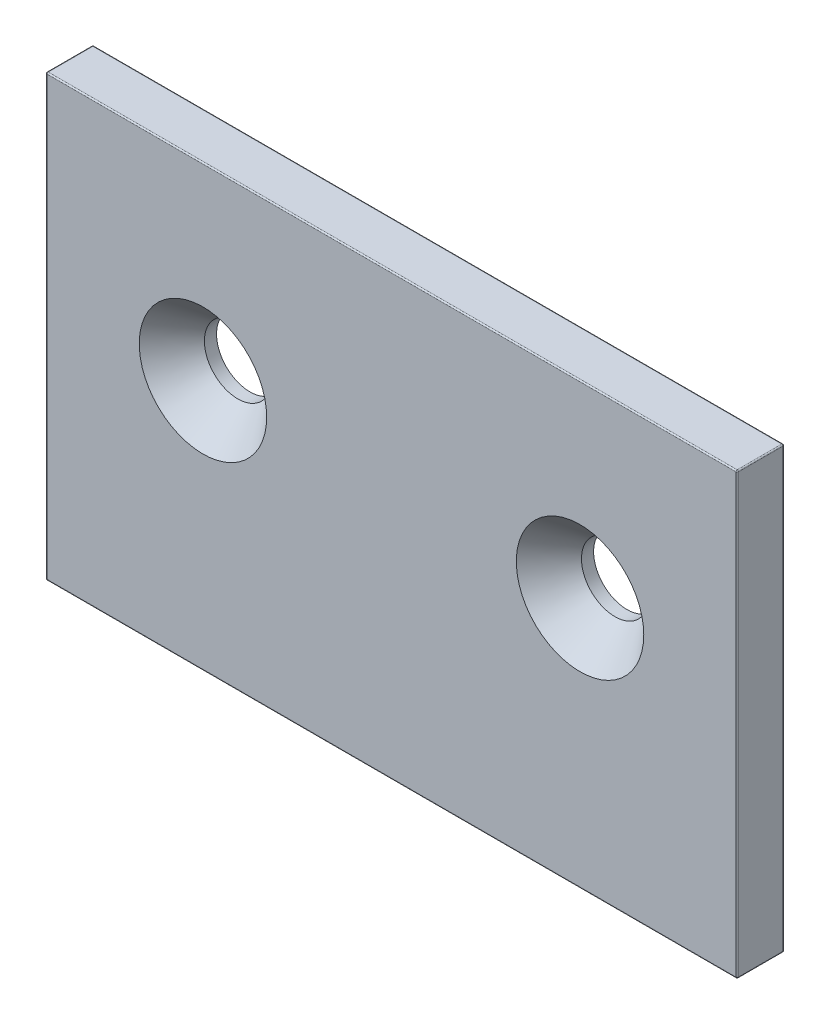
ISO-10303-21;
HEADER;
FILE_DESCRIPTION(('STEP AP214'),'2;1');
FILE_NAME('part.step','',(''),(''),'','','');
FILE_SCHEMA(('AUTOMOTIVE_DESIGN { 1 0 10303 214 1 1 1 1 }'));
ENDSEC;
DATA;
#1=APPLICATION_CONTEXT('core data for automotive mechanical design processes');
#2=APPLICATION_PROTOCOL_DEFINITION('international standard','automotive_design',2000,#1);
#3=PRODUCT_CONTEXT('',#1,'mechanical');
#4=PRODUCT('Part','Part','',(#3));
#5=PRODUCT_RELATED_PRODUCT_CATEGORY('part','',(#4));
#6=PRODUCT_DEFINITION_FORMATION('','',#4);
#7=PRODUCT_DEFINITION_CONTEXT('part definition',#1,'design');
#8=PRODUCT_DEFINITION('design','',#6,#7);
#9=PRODUCT_DEFINITION_SHAPE('','',#8);
#10=(LENGTH_UNIT() NAMED_UNIT(*) SI_UNIT(.MILLI.,.METRE.));
#11=(NAMED_UNIT(*) PLANE_ANGLE_UNIT() SI_UNIT($,.RADIAN.));
#12=(NAMED_UNIT(*) SI_UNIT($,.STERADIAN.) SOLID_ANGLE_UNIT());
#13=UNCERTAINTY_MEASURE_WITH_UNIT(LENGTH_MEASURE(1.E-05),#10,'distance_accuracy_value','');
#14=(GEOMETRIC_REPRESENTATION_CONTEXT(3) GLOBAL_UNCERTAINTY_ASSIGNED_CONTEXT((#13)) GLOBAL_UNIT_ASSIGNED_CONTEXT((#10,
#11,#12)) REPRESENTATION_CONTEXT('',''));
#15=CARTESIAN_POINT('',(0.,0.,0.));
#16=DIRECTION('',(0.,0.,1.));
#17=DIRECTION('',(1.,0.,0.));
#18=AXIS2_PLACEMENT_3D('',#15,#16,#17);
#19=CARTESIAN_POINT('',(-34.925,44.45,-4.7498));
#20=DIRECTION('',(-1.,0.,0.));
#21=DIRECTION('',(0.,0.,1.));
#22=AXIS2_PLACEMENT_3D('',#19,#20,#21);
#23=PLANE('',#22);
#24=DIRECTION('',(0.,-1.,0.));
#25=VECTOR('',#24,1.);
#26=CARTESIAN_POINT('',(-34.925,0.,-4.6228));
#27=LINE('',#26,#25);
#28=CARTESIAN_POINT('',(-34.925,44.323,-4.6228));
#29=VERTEX_POINT('',#28);
#30=CARTESIAN_POINT('',(-34.925,0.127000000000002,-4.6228));
#31=VERTEX_POINT('',#30);
#32=EDGE_CURVE('E138',#29,#31,#27,.T.);
#33=ORIENTED_EDGE('',*,*,#32,.T.);
#34=DIRECTION('',(0.,0.,1.));
#35=VECTOR('',#34,1.);
#36=CARTESIAN_POINT('',(-34.925,0.127000000000002,-4.7498));
#37=LINE('',#36,#35);
#38=CARTESIAN_POINT('',(-34.925,0.127000000000002,-0.127));
#39=VERTEX_POINT('',#38);
#40=EDGE_CURVE('E134',#31,#39,#37,.T.);
#41=ORIENTED_EDGE('',*,*,#40,.T.);
#42=DIRECTION('',(0.,-1.,0.));
#43=VECTOR('',#42,1.);
#44=CARTESIAN_POINT('',(-34.925,44.45,-0.127));
#45=LINE('',#44,#43);
#46=CARTESIAN_POINT('',(-34.925,44.323,-0.127));
#47=VERTEX_POINT('',#46);
#48=EDGE_CURVE('E127',#39,#47,#45,.F.);
#49=ORIENTED_EDGE('',*,*,#48,.T.);
#50=DIRECTION('',(0.,0.,1.));
#51=VECTOR('',#50,1.);
#52=CARTESIAN_POINT('',(-34.925,44.323,-4.7498));
#53=LINE('',#52,#51);
#54=EDGE_CURVE('E131',#47,#29,#53,.F.);
#55=ORIENTED_EDGE('',*,*,#54,.T.);
#56=EDGE_LOOP('',(#33,#41,#49,#55));
#57=FACE_BOUND('',#56,.T.);
#58=ADVANCED_FACE('F39',(#57),#23,.T.);
#59=CARTESIAN_POINT('',(-34.925,44.45,-4.7498));
#60=DIRECTION('',(0.,1.,0.));
#61=DIRECTION('',(0.,0.,1.));
#62=AXIS2_PLACEMENT_3D('',#59,#60,#61);
#63=PLANE('',#62);
#64=DIRECTION('',(-1.,0.,0.));
#65=VECTOR('',#64,1.);
#66=CARTESIAN_POINT('',(-34.925,44.45,-4.6228));
#67=LINE('',#66,#65);
#68=CARTESIAN_POINT('',(34.798,44.45,-4.6228));
#69=VERTEX_POINT('',#68);
#70=CARTESIAN_POINT('',(-34.798,44.45,-4.6228));
#71=VERTEX_POINT('',#70);
#72=EDGE_CURVE('E48',#69,#71,#67,.T.);
#73=ORIENTED_EDGE('',*,*,#72,.T.);
#74=DIRECTION('',(0.,0.,1.));
#75=VECTOR('',#74,1.);
#76=CARTESIAN_POINT('',(-34.798,44.45,-4.7498));
#77=LINE('',#76,#75);
#78=CARTESIAN_POINT('',(-34.798,44.45,-0.127));
#79=VERTEX_POINT('',#78);
#80=EDGE_CURVE('E11',#71,#79,#77,.T.);
#81=ORIENTED_EDGE('',*,*,#80,.T.);
#82=DIRECTION('',(-1.,0.,0.));
#83=VECTOR('',#82,1.);
#84=CARTESIAN_POINT('',(-34.925,44.45,-0.127));
#85=LINE('',#84,#83);
#86=CARTESIAN_POINT('',(34.798,44.45,-0.127));
#87=VERTEX_POINT('',#86);
#88=EDGE_CURVE('E207',#79,#87,#85,.F.);
#89=ORIENTED_EDGE('',*,*,#88,.T.);
#90=DIRECTION('',(0.,0.,1.));
#91=VECTOR('',#90,1.);
#92=CARTESIAN_POINT('',(34.798,44.45,-4.7498));
#93=LINE('',#92,#91);
#94=EDGE_CURVE('E59',#87,#69,#93,.F.);
#95=ORIENTED_EDGE('',*,*,#94,.T.);
#96=EDGE_LOOP('',(#73,#81,#89,#95));
#97=FACE_BOUND('',#96,.T.);
#98=ADVANCED_FACE('F313',(#97),#63,.T.);
#99=CARTESIAN_POINT('',(34.925,44.45,-4.7498));
#100=DIRECTION('',(1.,0.,0.));
#101=DIRECTION('',(0.,0.,-1.));
#102=AXIS2_PLACEMENT_3D('',#99,#100,#101);
#103=PLANE('',#102);
#104=DIRECTION('',(0.,1.,0.));
#105=VECTOR('',#104,1.);
#106=CARTESIAN_POINT('',(34.925,44.45,-0.127));
#107=LINE('',#106,#105);
#108=CARTESIAN_POINT('',(34.925,44.323,-0.127));
#109=VERTEX_POINT('',#108);
#110=CARTESIAN_POINT('',(34.925,0.127,-0.127));
#111=VERTEX_POINT('',#110);
#112=EDGE_CURVE('E191',#109,#111,#107,.F.);
#113=ORIENTED_EDGE('',*,*,#112,.T.);
#114=DIRECTION('',(0.,0.,1.));
#115=VECTOR('',#114,1.);
#116=CARTESIAN_POINT('',(34.925,0.127000000000002,-4.7498));
#117=LINE('',#116,#115);
#118=CARTESIAN_POINT('',(34.925,0.127,-4.6228));
#119=VERTEX_POINT('',#118);
#120=EDGE_CURVE('E196',#111,#119,#117,.F.);
#121=ORIENTED_EDGE('',*,*,#120,.T.);
#122=DIRECTION('',(0.,1.,0.));
#123=VECTOR('',#122,1.);
#124=CARTESIAN_POINT('',(34.925,44.45,-4.6228));
#125=LINE('',#124,#123);
#126=CARTESIAN_POINT('',(34.925,44.323,-4.6228));
#127=VERTEX_POINT('',#126);
#128=EDGE_CURVE('E193',#119,#127,#125,.T.);
#129=ORIENTED_EDGE('',*,*,#128,.T.);
#130=DIRECTION('',(0.,0.,1.));
#131=VECTOR('',#130,1.);
#132=CARTESIAN_POINT('',(34.925,44.323,-4.7498));
#133=LINE('',#132,#131);
#134=EDGE_CURVE('E189',#127,#109,#133,.T.);
#135=ORIENTED_EDGE('',*,*,#134,.T.);
#136=EDGE_LOOP('',(#113,#121,#129,#135));
#137=FACE_BOUND('',#136,.T.);
#138=ADVANCED_FACE('F319',(#137),#103,.T.);
#139=CARTESIAN_POINT('',(-34.925,0.,-4.7498));
#140=DIRECTION('',(0.,-1.,0.));
#141=DIRECTION('',(0.,0.,-1.));
#142=AXIS2_PLACEMENT_3D('',#139,#140,#141);
#143=PLANE('',#142);
#144=DIRECTION('',(1.,0.,0.));
#145=VECTOR('',#144,1.);
#146=CARTESIAN_POINT('',(34.925,0.,-4.6228));
#147=LINE('',#146,#145);
#148=CARTESIAN_POINT('',(-34.798,0.,-4.6228));
#149=VERTEX_POINT('',#148);
#150=CARTESIAN_POINT('',(34.798,0.,-4.6228));
#151=VERTEX_POINT('',#150);
#152=EDGE_CURVE('E202',#149,#151,#147,.T.);
#153=ORIENTED_EDGE('',*,*,#152,.T.);
#154=DIRECTION('',(0.,0.,1.));
#155=VECTOR('',#154,1.);
#156=CARTESIAN_POINT('',(34.798,0.,-4.7498));
#157=LINE('',#156,#155);
#158=CARTESIAN_POINT('',(34.798,0.,-0.127));
#159=VERTEX_POINT('',#158);
#160=EDGE_CURVE('E204',#151,#159,#157,.T.);
#161=ORIENTED_EDGE('',*,*,#160,.T.);
#162=DIRECTION('',(1.,0.,0.));
#163=VECTOR('',#162,1.);
#164=CARTESIAN_POINT('',(-34.925,0.,-0.127));
#165=LINE('',#164,#163);
#166=CARTESIAN_POINT('',(-34.798,0.,-0.127));
#167=VERTEX_POINT('',#166);
#168=EDGE_CURVE('E198',#159,#167,#165,.F.);
#169=ORIENTED_EDGE('',*,*,#168,.T.);
#170=DIRECTION('',(0.,0.,1.));
#171=VECTOR('',#170,1.);
#172=CARTESIAN_POINT('',(-34.798,0.,-4.7498));
#173=LINE('',#172,#171);
#174=EDGE_CURVE('E200',#167,#149,#173,.F.);
#175=ORIENTED_EDGE('',*,*,#174,.T.);
#176=EDGE_LOOP('',(#153,#161,#169,#175));
#177=FACE_BOUND('',#176,.T.);
#178=ADVANCED_FACE('F307',(#177),#143,.T.);
#179=CARTESIAN_POINT('',(0.,0.,-4.7498));
#180=DIRECTION('',(0.,0.,1.));
#181=DIRECTION('',(1.,0.,0.));
#182=AXIS2_PLACEMENT_3D('',#179,#180,#181);
#183=PLANE('',#182);
#184=DIRECTION('',(0.,1.,0.));
#185=VECTOR('',#184,1.);
#186=CARTESIAN_POINT('',(34.798,0.,-4.7498));
#187=LINE('',#186,#185);
#188=CARTESIAN_POINT('',(34.798,44.323,-4.7498));
#189=VERTEX_POINT('',#188);
#190=CARTESIAN_POINT('',(34.798,0.127,-4.7498));
#191=VERTEX_POINT('',#190);
#192=EDGE_CURVE('E175',#189,#191,#187,.F.);
#193=ORIENTED_EDGE('',*,*,#192,.T.);
#194=DIRECTION('',(1.,0.,0.));
#195=VECTOR('',#194,1.);
#196=CARTESIAN_POINT('',(-34.925,0.127,-4.7498));
#197=LINE('',#196,#195);
#198=CARTESIAN_POINT('',(-34.798,0.127,-4.7498));
#199=VERTEX_POINT('',#198);
#200=EDGE_CURVE('E180',#191,#199,#197,.F.);
#201=ORIENTED_EDGE('',*,*,#200,.T.);
#202=DIRECTION('',(0.,-1.,0.));
#203=VECTOR('',#202,1.);
#204=CARTESIAN_POINT('',(-34.798,44.45,-4.7498));
#205=LINE('',#204,#203);
#206=CARTESIAN_POINT('',(-34.798,44.323,-4.7498));
#207=VERTEX_POINT('',#206);
#208=EDGE_CURVE('E177',#199,#207,#205,.F.);
#209=ORIENTED_EDGE('',*,*,#208,.T.);
#210=DIRECTION('',(-1.,0.,0.));
#211=VECTOR('',#210,1.);
#212=CARTESIAN_POINT('',(34.925,44.323,-4.7498));
#213=LINE('',#212,#211);
#214=EDGE_CURVE('E173',#207,#189,#213,.F.);
#215=ORIENTED_EDGE('',*,*,#214,.T.);
#216=EDGE_LOOP('',(#193,#201,#209,#215));
#217=FACE_BOUND('',#216,.T.);
#218=CARTESIAN_POINT('',(-19.05,25.4,-4.7498));
#219=DIRECTION('',(0.,0.,1.));
#220=DIRECTION('',(1.,0.,0.));
#221=AXIS2_PLACEMENT_3D('',#218,#219,#220);
#222=CIRCLE('',#221,3.3782);
#223=CARTESIAN_POINT('',(-15.6718,25.4,-4.7498));
#224=VERTEX_POINT('',#223);
#225=EDGE_CURVE('E276',#224,#224,#222,.T.);
#226=ORIENTED_EDGE('',*,*,#225,.T.);
#227=EDGE_LOOP('',(#226));
#228=FACE_BOUND('',#227,.T.);
#229=CARTESIAN_POINT('',(19.05,25.4,-4.7498));
#230=DIRECTION('',(0.,0.,1.));
#231=DIRECTION('',(1.,0.,0.));
#232=AXIS2_PLACEMENT_3D('',#229,#230,#231);
#233=CIRCLE('',#232,3.3782);
#234=CARTESIAN_POINT('',(22.4282,25.4,-4.7498));
#235=VERTEX_POINT('',#234);
#236=EDGE_CURVE('E164',#235,#235,#233,.T.);
#237=ORIENTED_EDGE('',*,*,#236,.T.);
#238=EDGE_LOOP('',(#237));
#239=FACE_BOUND('',#238,.T.);
#240=ADVANCED_FACE('F297',(#217,#228,#239),#183,.F.);
#241=CARTESIAN_POINT('',(0.,0.,0.));
#242=DIRECTION('',(0.,0.,1.));
#243=DIRECTION('',(1.,0.,0.));
#244=AXIS2_PLACEMENT_3D('',#241,#242,#243);
#245=PLANE('',#244);
#246=DIRECTION('',(0.,-1.,0.));
#247=VECTOR('',#246,1.);
#248=CARTESIAN_POINT('',(-34.798,0.,0.));
#249=LINE('',#248,#247);
#250=CARTESIAN_POINT('',(-34.798,44.323,0.));
#251=VERTEX_POINT('',#250);
#252=CARTESIAN_POINT('',(-34.798,0.127,0.));
#253=VERTEX_POINT('',#252);
#254=EDGE_CURVE('E146',#251,#253,#249,.T.);
#255=ORIENTED_EDGE('',*,*,#254,.T.);
#256=DIRECTION('',(1.,0.,0.));
#257=VECTOR('',#256,1.);
#258=CARTESIAN_POINT('',(0.,0.127,0.));
#259=LINE('',#258,#257);
#260=CARTESIAN_POINT('',(34.798,0.127,0.));
#261=VERTEX_POINT('',#260);
#262=EDGE_CURVE('E187',#253,#261,#259,.T.);
#263=ORIENTED_EDGE('',*,*,#262,.T.);
#264=DIRECTION('',(0.,1.,0.));
#265=VECTOR('',#264,1.);
#266=CARTESIAN_POINT('',(34.798,0.,0.));
#267=LINE('',#266,#265);
#268=CARTESIAN_POINT('',(34.798,44.323,0.));
#269=VERTEX_POINT('',#268);
#270=EDGE_CURVE('E184',#261,#269,#267,.T.);
#271=ORIENTED_EDGE('',*,*,#270,.T.);
#272=DIRECTION('',(-1.,0.,0.));
#273=VECTOR('',#272,1.);
#274=CARTESIAN_POINT('',(0.,44.323,0.));
#275=LINE('',#274,#273);
#276=EDGE_CURVE('E182',#269,#251,#275,.T.);
#277=ORIENTED_EDGE('',*,*,#276,.T.);
#278=EDGE_LOOP('',(#255,#263,#271,#277));
#279=FACE_BOUND('',#278,.T.);
#280=CARTESIAN_POINT('',(-19.05,25.4,0.));
#281=DIRECTION('',(0.,0.,1.));
#282=DIRECTION('',(1.,0.,0.));
#283=AXIS2_PLACEMENT_3D('',#280,#281,#282);
#284=CIRCLE('',#283,6.4389);
#285=CARTESIAN_POINT('',(-12.6111,25.4,0.));
#286=VERTEX_POINT('',#285);
#287=EDGE_CURVE('E265',#286,#286,#284,.T.);
#288=ORIENTED_EDGE('',*,*,#287,.F.);
#289=EDGE_LOOP('',(#288));
#290=FACE_BOUND('',#289,.T.);
#291=CARTESIAN_POINT('',(19.05,25.4,0.));
#292=DIRECTION('',(0.,0.,1.));
#293=DIRECTION('',(1.,0.,0.));
#294=AXIS2_PLACEMENT_3D('',#291,#292,#293);
#295=CIRCLE('',#294,6.4389);
#296=CARTESIAN_POINT('',(25.4889,25.4,0.));
#297=VERTEX_POINT('',#296);
#298=EDGE_CURVE('E281',#297,#297,#295,.T.);
#299=ORIENTED_EDGE('',*,*,#298,.F.);
#300=EDGE_LOOP('',(#299));
#301=FACE_BOUND('',#300,.T.);
#302=ADVANCED_FACE('F295',(#279,#290,#301),#245,.T.);
#303=CARTESIAN_POINT('',(19.05,25.4,0.));
#304=DIRECTION('',(0.,0.,1.));
#305=DIRECTION('',(1.,0.,0.));
#306=AXIS2_PLACEMENT_3D('',#303,#304,#305);
#307=CYLINDRICAL_SURFACE('',#306,3.3782);
#308=ORIENTED_EDGE('',*,*,#236,.F.);
#309=EDGE_LOOP('',(#308));
#310=FACE_BOUND('',#309,.T.);
#311=CARTESIAN_POINT('',(19.05,25.4,-3.52093258398134));
#312=DIRECTION('',(0.,0.,1.));
#313=DIRECTION('',(1.,0.,0.));
#314=AXIS2_PLACEMENT_3D('',#311,#312,#313);
#315=CIRCLE('',#314,3.3782);
#316=CARTESIAN_POINT('',(22.4282,25.4,-3.52093258398134));
#317=VERTEX_POINT('',#316);
#318=EDGE_CURVE('E167',#317,#317,#315,.T.);
#319=ORIENTED_EDGE('',*,*,#318,.T.);
#320=EDGE_LOOP('',(#319));
#321=FACE_BOUND('',#320,.T.);
#322=ADVANCED_FACE('F286',(#310,#321),#307,.F.);
#323=CARTESIAN_POINT('',(19.05,25.4,0.));
#324=DIRECTION('',(0.,0.,1.));
#325=DIRECTION('',(1.,0.,0.));
#326=AXIS2_PLACEMENT_3D('',#323,#324,#325);
#327=CONICAL_SURFACE('',#326,6.4389,0.715584993317676);
#328=ORIENTED_EDGE('',*,*,#318,.F.);
#329=EDGE_LOOP('',(#328));
#330=FACE_BOUND('',#329,.T.);
#331=ORIENTED_EDGE('',*,*,#298,.T.);
#332=EDGE_LOOP('',(#331));
#333=FACE_BOUND('',#332,.T.);
#334=ADVANCED_FACE('F288',(#330,#333),#327,.F.);
#335=CARTESIAN_POINT('',(-19.05,25.4,0.));
#336=DIRECTION('',(0.,0.,1.));
#337=DIRECTION('',(1.,0.,0.));
#338=AXIS2_PLACEMENT_3D('',#335,#336,#337);
#339=CYLINDRICAL_SURFACE('',#338,3.3782);
#340=ORIENTED_EDGE('',*,*,#225,.F.);
#341=EDGE_LOOP('',(#340));
#342=FACE_BOUND('',#341,.T.);
#343=CARTESIAN_POINT('',(-19.05,25.4,-3.52093258398134));
#344=DIRECTION('',(0.,0.,1.));
#345=DIRECTION('',(1.,0.,0.));
#346=AXIS2_PLACEMENT_3D('',#343,#344,#345);
#347=CIRCLE('',#346,3.3782);
#348=CARTESIAN_POINT('',(-15.6718,25.4,-3.52093258398134));
#349=VERTEX_POINT('',#348);
#350=EDGE_CURVE('E271',#349,#349,#347,.T.);
#351=ORIENTED_EDGE('',*,*,#350,.T.);
#352=EDGE_LOOP('',(#351));
#353=FACE_BOUND('',#352,.T.);
#354=ADVANCED_FACE('F291',(#342,#353),#339,.F.);
#355=CARTESIAN_POINT('',(-19.05,25.4,0.));
#356=DIRECTION('',(0.,0.,1.));
#357=DIRECTION('',(1.,0.,0.));
#358=AXIS2_PLACEMENT_3D('',#355,#356,#357);
#359=CONICAL_SURFACE('',#358,6.4389,0.715584993317676);
#360=ORIENTED_EDGE('',*,*,#350,.F.);
#361=EDGE_LOOP('',(#360));
#362=FACE_BOUND('',#361,.T.);
#363=ORIENTED_EDGE('',*,*,#287,.T.);
#364=EDGE_LOOP('',(#363));
#365=FACE_BOUND('',#364,.T.);
#366=ADVANCED_FACE('F391',(#362,#365),#359,.F.);
#367=CARTESIAN_POINT('',(34.798,0.,-0.127));
#368=DIRECTION('',(0.,1.,0.));
#369=DIRECTION('',(0.,0.,1.));
#370=AXIS2_PLACEMENT_3D('',#367,#368,#369);
#371=CYLINDRICAL_SURFACE('',#370,0.127);
#372=CARTESIAN_POINT('',(34.798,44.323,-0.127));
#373=DIRECTION('',(0.,1.,0.));
#374=DIRECTION('',(0.,0.,1.));
#375=AXIS2_PLACEMENT_3D('',#372,#373,#374);
#376=CIRCLE('',#375,0.127);
#377=EDGE_CURVE('E43',#269,#109,#376,.T.);
#378=ORIENTED_EDGE('',*,*,#377,.F.);
#379=ORIENTED_EDGE('',*,*,#270,.F.);
#380=CARTESIAN_POINT('',(34.798,0.127,-0.127));
#381=DIRECTION('',(0.,-1.,0.));
#382=DIRECTION('',(0.,0.,-1.));
#383=AXIS2_PLACEMENT_3D('',#380,#381,#382);
#384=CIRCLE('',#383,0.127);
#385=EDGE_CURVE('E258',#111,#261,#384,.T.);
#386=ORIENTED_EDGE('',*,*,#385,.F.);
#387=ORIENTED_EDGE('',*,*,#112,.F.);
#388=EDGE_LOOP('',(#378,#379,#386,#387));
#389=FACE_BOUND('',#388,.T.);
#390=ADVANCED_FACE('F41',(#389),#371,.T.);
#391=CARTESIAN_POINT('',(34.798,44.323,-0.127));
#392=DIRECTION('',(1.,0.,0.));
#393=DIRECTION('',(0.,0.,-1.));
#394=AXIS2_PLACEMENT_3D('',#391,#392,#393);
#395=SPHERICAL_SURFACE('',#394,0.127);
#396=CARTESIAN_POINT('',(34.798,44.323,-0.127));
#397=DIRECTION('',(1.,0.,0.));
#398=DIRECTION('',(0.,0.,-1.));
#399=AXIS2_PLACEMENT_3D('',#396,#397,#398);
#400=CIRCLE('',#399,0.127);
#401=EDGE_CURVE('E253',#269,#87,#400,.F.);
#402=ORIENTED_EDGE('',*,*,#401,.F.);
#403=ORIENTED_EDGE('',*,*,#377,.T.);
#404=CARTESIAN_POINT('',(34.798,44.323,-0.127));
#405=DIRECTION('',(0.,0.,1.));
#406=DIRECTION('',(1.,0.,0.));
#407=AXIS2_PLACEMENT_3D('',#404,#405,#406);
#408=CIRCLE('',#407,0.127);
#409=EDGE_CURVE('E256',#87,#109,#408,.F.);
#410=ORIENTED_EDGE('',*,*,#409,.F.);
#411=EDGE_LOOP('',(#402,#403,#410));
#412=FACE_BOUND('',#411,.T.);
#413=ADVANCED_FACE('F387',(#412),#395,.T.);
#414=CARTESIAN_POINT('',(34.798,0.127,-0.127));
#415=DIRECTION('',(0.,0.,1.));
#416=DIRECTION('',(1.,0.,0.));
#417=AXIS2_PLACEMENT_3D('',#414,#415,#416);
#418=SPHERICAL_SURFACE('',#417,0.127);
#419=CARTESIAN_POINT('',(34.798,0.127,-0.127));
#420=DIRECTION('',(0.,0.,1.));
#421=DIRECTION('',(1.,0.,0.));
#422=AXIS2_PLACEMENT_3D('',#419,#420,#421);
#423=CIRCLE('',#422,0.127);
#424=EDGE_CURVE('E247',#111,#159,#423,.F.);
#425=ORIENTED_EDGE('',*,*,#424,.F.);
#426=ORIENTED_EDGE('',*,*,#385,.T.);
#427=CARTESIAN_POINT('',(34.798,0.127,-0.127));
#428=DIRECTION('',(1.,0.,0.));
#429=DIRECTION('',(0.,0.,-1.));
#430=AXIS2_PLACEMENT_3D('',#427,#428,#429);
#431=CIRCLE('',#430,0.127);
#432=EDGE_CURVE('E250',#159,#261,#431,.F.);
#433=ORIENTED_EDGE('',*,*,#432,.F.);
#434=EDGE_LOOP('',(#425,#426,#433));
#435=FACE_BOUND('',#434,.T.);
#436=ADVANCED_FACE('F384',(#435),#418,.T.);
#437=CARTESIAN_POINT('',(34.798,44.323,-4.7498));
#438=DIRECTION('',(0.,0.,1.));
#439=DIRECTION('',(1.,0.,0.));
#440=AXIS2_PLACEMENT_3D('',#437,#438,#439);
#441=CYLINDRICAL_SURFACE('',#440,0.127);
#442=ORIENTED_EDGE('',*,*,#409,.T.);
#443=ORIENTED_EDGE('',*,*,#134,.F.);
#444=CARTESIAN_POINT('',(34.798,44.323,-4.6228));
#445=DIRECTION('',(0.,0.,-1.));
#446=DIRECTION('',(-1.,0.,0.));
#447=AXIS2_PLACEMENT_3D('',#444,#445,#446);
#448=CIRCLE('',#447,0.127);
#449=EDGE_CURVE('E242',#69,#127,#448,.T.);
#450=ORIENTED_EDGE('',*,*,#449,.F.);
#451=ORIENTED_EDGE('',*,*,#94,.F.);
#452=EDGE_LOOP('',(#442,#443,#450,#451));
#453=FACE_BOUND('',#452,.T.);
#454=ADVANCED_FACE('F380',(#453),#441,.T.);
#455=CARTESIAN_POINT('',(0.,44.323,-0.127));
#456=DIRECTION('',(-1.,0.,0.));
#457=DIRECTION('',(0.,0.,1.));
#458=AXIS2_PLACEMENT_3D('',#455,#456,#457);
#459=CYLINDRICAL_SURFACE('',#458,0.127);
#460=ORIENTED_EDGE('',*,*,#401,.T.);
#461=ORIENTED_EDGE('',*,*,#88,.F.);
#462=CARTESIAN_POINT('',(-34.798,44.323,-0.127));
#463=DIRECTION('',(-1.,0.,0.));
#464=DIRECTION('',(0.,0.,1.));
#465=AXIS2_PLACEMENT_3D('',#462,#463,#464);
#466=CIRCLE('',#465,0.127);
#467=EDGE_CURVE('E150',#251,#79,#466,.T.);
#468=ORIENTED_EDGE('',*,*,#467,.F.);
#469=ORIENTED_EDGE('',*,*,#276,.F.);
#470=EDGE_LOOP('',(#460,#461,#468,#469));
#471=FACE_BOUND('',#470,.T.);
#472=ADVANCED_FACE('F377',(#471),#459,.T.);
#473=CARTESIAN_POINT('',(-34.798,0.,-0.127));
#474=DIRECTION('',(0.,-1.,0.));
#475=DIRECTION('',(0.,0.,-1.));
#476=AXIS2_PLACEMENT_3D('',#473,#474,#475);
#477=CYLINDRICAL_SURFACE('',#476,0.127);
#478=CARTESIAN_POINT('',(-34.798,0.127,-0.127));
#479=DIRECTION('',(0.,-1.,0.));
#480=DIRECTION('',(1.,0.,0.));
#481=AXIS2_PLACEMENT_3D('',#478,#479,#480);
#482=CIRCLE('',#481,0.127);
#483=EDGE_CURVE('E151',#253,#39,#482,.T.);
#484=ORIENTED_EDGE('',*,*,#483,.F.);
#485=ORIENTED_EDGE('',*,*,#254,.F.);
#486=CARTESIAN_POINT('',(-34.798,44.323,-0.127));
#487=DIRECTION('',(0.,1.,0.));
#488=DIRECTION('',(0.,0.,1.));
#489=AXIS2_PLACEMENT_3D('',#486,#487,#488);
#490=CIRCLE('',#489,0.127);
#491=EDGE_CURVE('E142',#47,#251,#490,.T.);
#492=ORIENTED_EDGE('',*,*,#491,.F.);
#493=ORIENTED_EDGE('',*,*,#48,.F.);
#494=EDGE_LOOP('',(#484,#485,#492,#493));
#495=FACE_BOUND('',#494,.T.);
#496=ADVANCED_FACE('F144',(#495),#477,.T.);
#497=CARTESIAN_POINT('',(0.,0.127,-0.127));
#498=DIRECTION('',(1.,0.,0.));
#499=DIRECTION('',(0.,0.,-1.));
#500=AXIS2_PLACEMENT_3D('',#497,#498,#499);
#501=CYLINDRICAL_SURFACE('',#500,0.127);
#502=ORIENTED_EDGE('',*,*,#432,.T.);
#503=ORIENTED_EDGE('',*,*,#262,.F.);
#504=CARTESIAN_POINT('',(-34.798,0.127,-0.127));
#505=DIRECTION('',(-1.,0.,0.));
#506=DIRECTION('',(0.,0.,1.));
#507=AXIS2_PLACEMENT_3D('',#504,#505,#506);
#508=CIRCLE('',#507,0.127);
#509=EDGE_CURVE('E238',#167,#253,#508,.T.);
#510=ORIENTED_EDGE('',*,*,#509,.F.);
#511=ORIENTED_EDGE('',*,*,#168,.F.);
#512=EDGE_LOOP('',(#502,#503,#510,#511));
#513=FACE_BOUND('',#512,.T.);
#514=ADVANCED_FACE('F370',(#513),#501,.T.);
#515=CARTESIAN_POINT('',(34.798,0.127,-4.7498));
#516=DIRECTION('',(0.,0.,1.));
#517=DIRECTION('',(1.,0.,0.));
#518=AXIS2_PLACEMENT_3D('',#515,#516,#517);
#519=CYLINDRICAL_SURFACE('',#518,0.127);
#520=ORIENTED_EDGE('',*,*,#424,.T.);
#521=ORIENTED_EDGE('',*,*,#160,.F.);
#522=CARTESIAN_POINT('',(34.798,0.127,-4.6228));
#523=DIRECTION('',(0.,0.,-1.));
#524=DIRECTION('',(-1.,0.,0.));
#525=AXIS2_PLACEMENT_3D('',#522,#523,#524);
#526=CIRCLE('',#525,0.127);
#527=EDGE_CURVE('E235',#119,#151,#526,.T.);
#528=ORIENTED_EDGE('',*,*,#527,.F.);
#529=ORIENTED_EDGE('',*,*,#120,.F.);
#530=EDGE_LOOP('',(#520,#521,#528,#529));
#531=FACE_BOUND('',#530,.T.);
#532=ADVANCED_FACE('F366',(#531),#519,.T.);
#533=CARTESIAN_POINT('',(34.798,44.45,-4.6228));
#534=DIRECTION('',(0.,-1.,0.));
#535=DIRECTION('',(0.,0.,-1.));
#536=AXIS2_PLACEMENT_3D('',#533,#534,#535);
#537=CYLINDRICAL_SURFACE('',#536,0.127);
#538=CARTESIAN_POINT('',(34.798,44.323,-4.6228));
#539=DIRECTION('',(0.,1.,0.));
#540=DIRECTION('',(0.,0.,1.));
#541=AXIS2_PLACEMENT_3D('',#538,#539,#540);
#542=CIRCLE('',#541,0.127);
#543=EDGE_CURVE('E244',#127,#189,#542,.T.);
#544=ORIENTED_EDGE('',*,*,#543,.F.);
#545=ORIENTED_EDGE('',*,*,#128,.F.);
#546=CARTESIAN_POINT('',(34.798,0.127,-4.6228));
#547=DIRECTION('',(0.,-1.,0.));
#548=DIRECTION('',(0.,0.,-1.));
#549=AXIS2_PLACEMENT_3D('',#546,#547,#548);
#550=CIRCLE('',#549,0.127);
#551=EDGE_CURVE('E232',#191,#119,#550,.T.);
#552=ORIENTED_EDGE('',*,*,#551,.F.);
#553=ORIENTED_EDGE('',*,*,#192,.F.);
#554=EDGE_LOOP('',(#544,#545,#552,#553));
#555=FACE_BOUND('',#554,.T.);
#556=ADVANCED_FACE('F362',(#555),#537,.T.);
#557=CARTESIAN_POINT('',(34.798,44.323,-4.6228));
#558=DIRECTION('',(1.,0.,0.));
#559=DIRECTION('',(0.,0.,-1.));
#560=AXIS2_PLACEMENT_3D('',#557,#558,#559);
#561=SPHERICAL_SURFACE('',#560,0.127);
#562=ORIENTED_EDGE('',*,*,#449,.T.);
#563=ORIENTED_EDGE('',*,*,#543,.T.);
#564=CARTESIAN_POINT('',(34.798,44.323,-4.6228));
#565=DIRECTION('',(1.,0.,0.));
#566=DIRECTION('',(0.,0.,-1.));
#567=AXIS2_PLACEMENT_3D('',#564,#565,#566);
#568=CIRCLE('',#567,0.127);
#569=EDGE_CURVE('E157',#69,#189,#568,.F.);
#570=ORIENTED_EDGE('',*,*,#569,.F.);
#571=EDGE_LOOP('',(#562,#563,#570));
#572=FACE_BOUND('',#571,.T.);
#573=ADVANCED_FACE('F359',(#572),#561,.T.);
#574=CARTESIAN_POINT('',(-34.798,44.323,-0.127));
#575=DIRECTION('',(0.,0.,1.));
#576=DIRECTION('',(1.,0.,0.));
#577=AXIS2_PLACEMENT_3D('',#574,#575,#576);
#578=SPHERICAL_SURFACE('',#577,0.127);
#579=ORIENTED_EDGE('',*,*,#491,.T.);
#580=ORIENTED_EDGE('',*,*,#467,.T.);
#581=CARTESIAN_POINT('',(-34.798,44.323,-0.127));
#582=DIRECTION('',(0.,0.,1.));
#583=DIRECTION('',(1.,0.,0.));
#584=AXIS2_PLACEMENT_3D('',#581,#582,#583);
#585=CIRCLE('',#584,0.127);
#586=EDGE_CURVE('E153',#47,#79,#585,.F.);
#587=ORIENTED_EDGE('',*,*,#586,.F.);
#588=EDGE_LOOP('',(#579,#580,#587));
#589=FACE_BOUND('',#588,.T.);
#590=ADVANCED_FACE('F154',(#589),#578,.T.);
#591=CARTESIAN_POINT('',(-34.798,0.127,-0.127));
#592=DIRECTION('',(0.,0.,1.));
#593=DIRECTION('',(1.,0.,0.));
#594=AXIS2_PLACEMENT_3D('',#591,#592,#593);
#595=SPHERICAL_SURFACE('',#594,0.127);
#596=ORIENTED_EDGE('',*,*,#509,.T.);
#597=ORIENTED_EDGE('',*,*,#483,.T.);
#598=CARTESIAN_POINT('',(-34.798,0.127000000000002,-0.127));
#599=DIRECTION('',(0.,0.,1.));
#600=DIRECTION('',(1.,0.,0.));
#601=AXIS2_PLACEMENT_3D('',#598,#599,#600);
#602=CIRCLE('',#601,0.127);
#603=EDGE_CURVE('E158',#167,#39,#602,.F.);
#604=ORIENTED_EDGE('',*,*,#603,.F.);
#605=EDGE_LOOP('',(#596,#597,#604));
#606=FACE_BOUND('',#605,.T.);
#607=ADVANCED_FACE('F352',(#606),#595,.T.);
#608=CARTESIAN_POINT('',(34.798,0.127,-4.6228));
#609=DIRECTION('',(1.,0.,0.));
#610=DIRECTION('',(0.,0.,-1.));
#611=AXIS2_PLACEMENT_3D('',#608,#609,#610);
#612=SPHERICAL_SURFACE('',#611,0.127);
#613=ORIENTED_EDGE('',*,*,#551,.T.);
#614=ORIENTED_EDGE('',*,*,#527,.T.);
#615=CARTESIAN_POINT('',(34.798,0.127,-4.6228));
#616=DIRECTION('',(1.,0.,0.));
#617=DIRECTION('',(0.,0.,-1.));
#618=AXIS2_PLACEMENT_3D('',#615,#616,#617);
#619=CIRCLE('',#618,0.127);
#620=EDGE_CURVE('E225',#191,#151,#619,.F.);
#621=ORIENTED_EDGE('',*,*,#620,.F.);
#622=EDGE_LOOP('',(#613,#614,#621));
#623=FACE_BOUND('',#622,.T.);
#624=ADVANCED_FACE('F348',(#623),#612,.T.);
#625=CARTESIAN_POINT('',(-34.925,44.323,-4.6228));
#626=DIRECTION('',(1.,0.,0.));
#627=DIRECTION('',(0.,0.,-1.));
#628=AXIS2_PLACEMENT_3D('',#625,#626,#627);
#629=CYLINDRICAL_SURFACE('',#628,0.127);
#630=ORIENTED_EDGE('',*,*,#569,.T.);
#631=ORIENTED_EDGE('',*,*,#214,.F.);
#632=CARTESIAN_POINT('',(-34.798,44.323,-4.6228));
#633=DIRECTION('',(-1.,0.,0.));
#634=DIRECTION('',(0.,0.,1.));
#635=AXIS2_PLACEMENT_3D('',#632,#633,#634);
#636=CIRCLE('',#635,0.127);
#637=EDGE_CURVE('E222',#71,#207,#636,.T.);
#638=ORIENTED_EDGE('',*,*,#637,.F.);
#639=ORIENTED_EDGE('',*,*,#72,.F.);
#640=EDGE_LOOP('',(#630,#631,#638,#639));
#641=FACE_BOUND('',#640,.T.);
#642=ADVANCED_FACE('F345',(#641),#629,.T.);
#643=CARTESIAN_POINT('',(-34.798,44.323,-4.7498));
#644=DIRECTION('',(0.,0.,1.));
#645=DIRECTION('',(1.,0.,0.));
#646=AXIS2_PLACEMENT_3D('',#643,#644,#645);
#647=CYLINDRICAL_SURFACE('',#646,0.127);
#648=ORIENTED_EDGE('',*,*,#586,.T.);
#649=ORIENTED_EDGE('',*,*,#80,.F.);
#650=CARTESIAN_POINT('',(-34.798,44.323,-4.6228));
#651=DIRECTION('',(0.,0.,-1.));
#652=DIRECTION('',(-1.,0.,0.));
#653=AXIS2_PLACEMENT_3D('',#650,#651,#652);
#654=CIRCLE('',#653,0.127);
#655=EDGE_CURVE('E162',#29,#71,#654,.T.);
#656=ORIENTED_EDGE('',*,*,#655,.F.);
#657=ORIENTED_EDGE('',*,*,#54,.F.);
#658=EDGE_LOOP('',(#648,#649,#656,#657));
#659=FACE_BOUND('',#658,.T.);
#660=ADVANCED_FACE('F160',(#659),#647,.T.);
#661=CARTESIAN_POINT('',(-34.798,0.127000000000002,-4.7498));
#662=DIRECTION('',(0.,0.,1.));
#663=DIRECTION('',(1.,0.,0.));
#664=AXIS2_PLACEMENT_3D('',#661,#662,#663);
#665=CYLINDRICAL_SURFACE('',#664,0.127);
#666=ORIENTED_EDGE('',*,*,#603,.T.);
#667=ORIENTED_EDGE('',*,*,#40,.F.);
#668=CARTESIAN_POINT('',(-34.798,0.127,-4.6228));
#669=DIRECTION('',(0.,0.,-1.));
#670=DIRECTION('',(-1.,0.,0.));
#671=AXIS2_PLACEMENT_3D('',#668,#669,#670);
#672=CIRCLE('',#671,0.127);
#673=EDGE_CURVE('E218',#149,#31,#672,.T.);
#674=ORIENTED_EDGE('',*,*,#673,.F.);
#675=ORIENTED_EDGE('',*,*,#174,.F.);
#676=EDGE_LOOP('',(#666,#667,#674,#675));
#677=FACE_BOUND('',#676,.T.);
#678=ADVANCED_FACE('F338',(#677),#665,.T.);
#679=CARTESIAN_POINT('',(-34.925,0.127,-4.6228));
#680=DIRECTION('',(-1.,0.,0.));
#681=DIRECTION('',(0.,0.,1.));
#682=AXIS2_PLACEMENT_3D('',#679,#680,#681);
#683=CYLINDRICAL_SURFACE('',#682,0.127);
#684=ORIENTED_EDGE('',*,*,#620,.T.);
#685=ORIENTED_EDGE('',*,*,#152,.F.);
#686=CARTESIAN_POINT('',(-34.798,0.127,-4.6228));
#687=DIRECTION('',(-1.,0.,0.));
#688=DIRECTION('',(0.,0.,1.));
#689=AXIS2_PLACEMENT_3D('',#686,#687,#688);
#690=CIRCLE('',#689,0.127);
#691=EDGE_CURVE('E215',#199,#149,#690,.T.);
#692=ORIENTED_EDGE('',*,*,#691,.F.);
#693=ORIENTED_EDGE('',*,*,#200,.F.);
#694=EDGE_LOOP('',(#684,#685,#692,#693));
#695=FACE_BOUND('',#694,.T.);
#696=ADVANCED_FACE('F334',(#695),#683,.T.);
#697=CARTESIAN_POINT('',(-34.798,44.323,-4.6228));
#698=DIRECTION('',(0.,1.,0.));
#699=DIRECTION('',(0.,0.,1.));
#700=AXIS2_PLACEMENT_3D('',#697,#698,#699);
#701=SPHERICAL_SURFACE('',#700,0.127);
#702=ORIENTED_EDGE('',*,*,#655,.T.);
#703=ORIENTED_EDGE('',*,*,#637,.T.);
#704=CARTESIAN_POINT('',(-34.798,44.323,-4.6228));
#705=DIRECTION('',(0.,1.,0.));
#706=DIRECTION('',(0.,0.,1.));
#707=AXIS2_PLACEMENT_3D('',#704,#705,#706);
#708=CIRCLE('',#707,0.127);
#709=EDGE_CURVE('E213',#29,#207,#708,.F.);
#710=ORIENTED_EDGE('',*,*,#709,.F.);
#711=EDGE_LOOP('',(#702,#703,#710));
#712=FACE_BOUND('',#711,.T.);
#713=ADVANCED_FACE('F330',(#712),#701,.T.);
#714=CARTESIAN_POINT('',(-34.798,0.127,-4.6228));
#715=DIRECTION('',(0.,-1.,0.));
#716=DIRECTION('',(0.,0.,-1.));
#717=AXIS2_PLACEMENT_3D('',#714,#715,#716);
#718=SPHERICAL_SURFACE('',#717,0.127);
#719=ORIENTED_EDGE('',*,*,#691,.T.);
#720=ORIENTED_EDGE('',*,*,#673,.T.);
#721=CARTESIAN_POINT('',(-34.798,0.127000000000002,-4.6228));
#722=DIRECTION('',(0.,-1.,0.));
#723=DIRECTION('',(0.,0.,-1.));
#724=AXIS2_PLACEMENT_3D('',#721,#722,#723);
#725=CIRCLE('',#724,0.127);
#726=EDGE_CURVE('E211',#199,#31,#725,.F.);
#727=ORIENTED_EDGE('',*,*,#726,.F.);
#728=EDGE_LOOP('',(#719,#720,#727));
#729=FACE_BOUND('',#728,.T.);
#730=ADVANCED_FACE('F326',(#729),#718,.T.);
#731=CARTESIAN_POINT('',(-34.798,44.45,-4.6228));
#732=DIRECTION('',(0.,1.,0.));
#733=DIRECTION('',(0.,0.,1.));
#734=AXIS2_PLACEMENT_3D('',#731,#732,#733);
#735=CYLINDRICAL_SURFACE('',#734,0.127);
#736=ORIENTED_EDGE('',*,*,#709,.T.);
#737=ORIENTED_EDGE('',*,*,#208,.F.);
#738=ORIENTED_EDGE('',*,*,#726,.T.);
#739=ORIENTED_EDGE('',*,*,#32,.F.);
#740=EDGE_LOOP('',(#736,#737,#738,#739));
#741=FACE_BOUND('',#740,.T.);
#742=ADVANCED_FACE('F323',(#741),#735,.T.);
#743=CLOSED_SHELL('',(#58,#98,#138,#178,#240,#302,#322,#334,#354,#366,#390,#413,#436,#454,#472,
#496,#514,#532,#556,#573,#590,#607,#624,#642,#660,#678,#696,#713,#730,#742));
#744=MANIFOLD_SOLID_BREP('B2',#743);
#745=ADVANCED_BREP_SHAPE_REPRESENTATION('',(#18,#744),#14);
#746=SHAPE_DEFINITION_REPRESENTATION(#9,#745);
ENDSEC;
END-ISO-10303-21;
